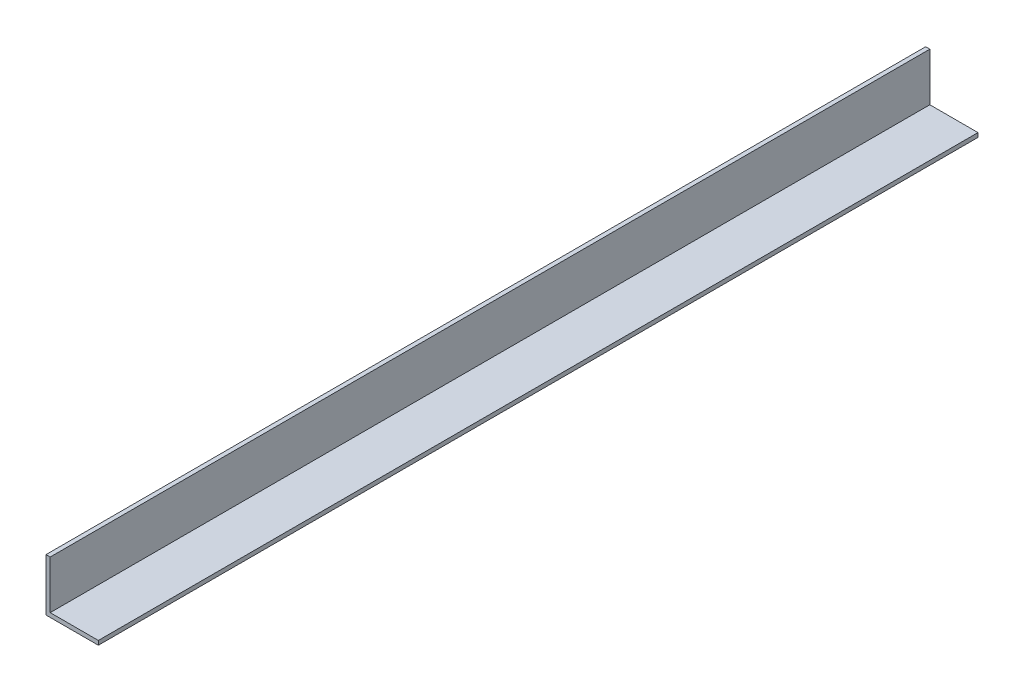
ISO-10303-21;
HEADER;
FILE_DESCRIPTION(('STEP AP214'),'2;1');
FILE_NAME('part.step','',(''),(''),'','','');
FILE_SCHEMA(('AUTOMOTIVE_DESIGN { 1 0 10303 214 1 1 1 1 }'));
ENDSEC;
DATA;
#1=APPLICATION_CONTEXT('core data for automotive mechanical design processes');
#2=APPLICATION_PROTOCOL_DEFINITION('international standard','automotive_design',2000,#1);
#3=PRODUCT_CONTEXT('',#1,'mechanical');
#4=PRODUCT('Part','Part','',(#3));
#5=PRODUCT_RELATED_PRODUCT_CATEGORY('part','',(#4));
#6=PRODUCT_DEFINITION_FORMATION('','',#4);
#7=PRODUCT_DEFINITION_CONTEXT('part definition',#1,'design');
#8=PRODUCT_DEFINITION('design','',#6,#7);
#9=PRODUCT_DEFINITION_SHAPE('','',#8);
#10=(LENGTH_UNIT() NAMED_UNIT(*) SI_UNIT(.MILLI.,.METRE.));
#11=(NAMED_UNIT(*) PLANE_ANGLE_UNIT() SI_UNIT($,.RADIAN.));
#12=(NAMED_UNIT(*) SI_UNIT($,.STERADIAN.) SOLID_ANGLE_UNIT());
#13=UNCERTAINTY_MEASURE_WITH_UNIT(LENGTH_MEASURE(1.E-05),#10,'distance_accuracy_value','');
#14=(GEOMETRIC_REPRESENTATION_CONTEXT(3) GLOBAL_UNCERTAINTY_ASSIGNED_CONTEXT((#13)) GLOBAL_UNIT_ASSIGNED_CONTEXT((#10,
#11,#12)) REPRESENTATION_CONTEXT('',''));
#15=CARTESIAN_POINT('',(0.,0.,0.));
#16=DIRECTION('',(0.,0.,1.));
#17=DIRECTION('',(1.,0.,0.));
#18=AXIS2_PLACEMENT_3D('',#15,#16,#17);
#19=CARTESIAN_POINT('',(-40.6131038732955,18.1238301559792,840.));
#20=DIRECTION('',(0.,-1.,0.));
#21=DIRECTION('',(0.,0.,-1.));
#22=AXIS2_PLACEMENT_3D('',#19,#20,#21);
#23=PLANE('',#22);
#24=DIRECTION('',(-1.,0.,0.));
#25=VECTOR('',#24,1.);
#26=CARTESIAN_POINT('',(-40.6131038732955,18.1238301559792,0.));
#27=LINE('',#26,#25);
#28=CARTESIAN_POINT('',(-36.6131038732955,18.1238301559792,0.));
#29=VERTEX_POINT('',#28);
#30=CARTESIAN_POINT('',(-40.6131038732955,18.1238301559792,0.));
#31=VERTEX_POINT('',#30);
#32=EDGE_CURVE('E117',#29,#31,#27,.T.);
#33=ORIENTED_EDGE('',*,*,#32,.T.);
#34=DIRECTION('',(0.,0.,-1.));
#35=VECTOR('',#34,1.);
#36=CARTESIAN_POINT('',(-40.6131038732955,18.1238301559792,840.));
#37=LINE('',#36,#35);
#38=CARTESIAN_POINT('',(-40.6131038732955,18.1238301559792,840.));
#39=VERTEX_POINT('',#38);
#40=EDGE_CURVE('E11',#39,#31,#37,.T.);
#41=ORIENTED_EDGE('',*,*,#40,.F.);
#42=DIRECTION('',(-1.,0.,0.));
#43=VECTOR('',#42,1.);
#44=CARTESIAN_POINT('',(-40.6131038732955,18.1238301559792,840.));
#45=LINE('',#44,#43);
#46=CARTESIAN_POINT('',(-36.6131038732955,18.1238301559792,840.));
#47=VERTEX_POINT('',#46);
#48=EDGE_CURVE('E127',#47,#39,#45,.T.);
#49=ORIENTED_EDGE('',*,*,#48,.F.);
#50=DIRECTION('',(0.,0.,-1.));
#51=VECTOR('',#50,1.);
#52=CARTESIAN_POINT('',(-36.6131038732955,18.1238301559792,840.));
#53=LINE('',#52,#51);
#54=EDGE_CURVE('E113',#47,#29,#53,.T.);
#55=ORIENTED_EDGE('',*,*,#54,.T.);
#56=EDGE_LOOP('',(#33,#41,#49,#55));
#57=FACE_BOUND('',#56,.T.);
#58=ADVANCED_FACE('F33',(#57),#23,.F.);
#59=CARTESIAN_POINT('',(-40.6131038732955,-31.8761698440208,840.));
#60=DIRECTION('',(1.,0.,0.));
#61=DIRECTION('',(0.,0.,-1.));
#62=AXIS2_PLACEMENT_3D('',#59,#60,#61);
#63=PLANE('',#62);
#64=DIRECTION('',(0.,-1.,0.));
#65=VECTOR('',#64,1.);
#66=CARTESIAN_POINT('',(-40.6131038732955,-31.8761698440208,0.));
#67=LINE('',#66,#65);
#68=CARTESIAN_POINT('',(-40.6131038732955,-31.8761698440208,0.));
#69=VERTEX_POINT('',#68);
#70=EDGE_CURVE('E120',#31,#69,#67,.T.);
#71=ORIENTED_EDGE('',*,*,#70,.T.);
#72=DIRECTION('',(0.,0.,-1.));
#73=VECTOR('',#72,1.);
#74=CARTESIAN_POINT('',(-40.6131038732955,-31.8761698440208,840.));
#75=LINE('',#74,#73);
#76=CARTESIAN_POINT('',(-40.6131038732955,-31.8761698440208,840.));
#77=VERTEX_POINT('',#76);
#78=EDGE_CURVE('E41',#77,#69,#75,.T.);
#79=ORIENTED_EDGE('',*,*,#78,.F.);
#80=DIRECTION('',(0.,-1.,0.));
#81=VECTOR('',#80,1.);
#82=CARTESIAN_POINT('',(-40.6131038732955,-31.8761698440208,840.));
#83=LINE('',#82,#81);
#84=EDGE_CURVE('E86',#39,#77,#83,.T.);
#85=ORIENTED_EDGE('',*,*,#84,.F.);
#86=ORIENTED_EDGE('',*,*,#40,.T.);
#87=EDGE_LOOP('',(#71,#79,#85,#86));
#88=FACE_BOUND('',#87,.T.);
#89=ADVANCED_FACE('F151',(#88),#63,.F.);
#90=CARTESIAN_POINT('',(9.38689612670451,-31.8761698440208,840.));
#91=DIRECTION('',(0.,1.,0.));
#92=DIRECTION('',(0.,0.,1.));
#93=AXIS2_PLACEMENT_3D('',#90,#91,#92);
#94=PLANE('',#93);
#95=DIRECTION('',(1.,0.,0.));
#96=VECTOR('',#95,1.);
#97=CARTESIAN_POINT('',(9.38689612670451,-31.8761698440208,0.));
#98=LINE('',#97,#96);
#99=CARTESIAN_POINT('',(9.38689612670451,-31.8761698440208,0.));
#100=VERTEX_POINT('',#99);
#101=EDGE_CURVE('E122',#69,#100,#98,.T.);
#102=ORIENTED_EDGE('',*,*,#101,.T.);
#103=DIRECTION('',(0.,0.,-1.));
#104=VECTOR('',#103,1.);
#105=CARTESIAN_POINT('',(9.38689612670451,-31.8761698440208,840.));
#106=LINE('',#105,#104);
#107=CARTESIAN_POINT('',(9.38689612670451,-31.8761698440208,840.));
#108=VERTEX_POINT('',#107);
#109=EDGE_CURVE('E108',#108,#100,#106,.T.);
#110=ORIENTED_EDGE('',*,*,#109,.F.);
#111=DIRECTION('',(1.,0.,0.));
#112=VECTOR('',#111,1.);
#113=CARTESIAN_POINT('',(9.38689612670451,-31.8761698440208,840.));
#114=LINE('',#113,#112);
#115=EDGE_CURVE('E99',#77,#108,#114,.T.);
#116=ORIENTED_EDGE('',*,*,#115,.F.);
#117=ORIENTED_EDGE('',*,*,#78,.T.);
#118=EDGE_LOOP('',(#102,#110,#116,#117));
#119=FACE_BOUND('',#118,.T.);
#120=ADVANCED_FACE('F133',(#119),#94,.F.);
#121=CARTESIAN_POINT('',(9.38689612670451,-27.8761698440208,840.));
#122=DIRECTION('',(-1.,0.,0.));
#123=DIRECTION('',(0.,0.,1.));
#124=AXIS2_PLACEMENT_3D('',#121,#122,#123);
#125=PLANE('',#124);
#126=DIRECTION('',(0.,1.,0.));
#127=VECTOR('',#126,1.);
#128=CARTESIAN_POINT('',(9.38689612670451,-27.8761698440208,0.));
#129=LINE('',#128,#127);
#130=CARTESIAN_POINT('',(9.38689612670451,-27.8761698440208,0.));
#131=VERTEX_POINT('',#130);
#132=EDGE_CURVE('E107',#100,#131,#129,.T.);
#133=ORIENTED_EDGE('',*,*,#132,.T.);
#134=DIRECTION('',(0.,0.,-1.));
#135=VECTOR('',#134,1.);
#136=CARTESIAN_POINT('',(9.38689612670451,-27.8761698440208,840.));
#137=LINE('',#136,#135);
#138=CARTESIAN_POINT('',(9.38689612670451,-27.8761698440208,840.));
#139=VERTEX_POINT('',#138);
#140=EDGE_CURVE('E104',#139,#131,#137,.T.);
#141=ORIENTED_EDGE('',*,*,#140,.F.);
#142=DIRECTION('',(0.,1.,0.));
#143=VECTOR('',#142,1.);
#144=CARTESIAN_POINT('',(9.38689612670451,-27.8761698440208,840.));
#145=LINE('',#144,#143);
#146=EDGE_CURVE('E93',#108,#139,#145,.T.);
#147=ORIENTED_EDGE('',*,*,#146,.F.);
#148=ORIENTED_EDGE('',*,*,#109,.T.);
#149=EDGE_LOOP('',(#133,#141,#147,#148));
#150=FACE_BOUND('',#149,.T.);
#151=ADVANCED_FACE('F105',(#150),#125,.F.);
#152=CARTESIAN_POINT('',(-36.6131038732955,-27.8761698440208,840.));
#153=DIRECTION('',(0.,-1.,0.));
#154=DIRECTION('',(0.,0.,-1.));
#155=AXIS2_PLACEMENT_3D('',#152,#153,#154);
#156=PLANE('',#155);
#157=DIRECTION('',(-1.,0.,0.));
#158=VECTOR('',#157,1.);
#159=CARTESIAN_POINT('',(-36.6131038732955,-27.8761698440208,0.));
#160=LINE('',#159,#158);
#161=CARTESIAN_POINT('',(-36.6131038732955,-27.8761698440208,0.));
#162=VERTEX_POINT('',#161);
#163=EDGE_CURVE('E72',#131,#162,#160,.T.);
#164=ORIENTED_EDGE('',*,*,#163,.T.);
#165=DIRECTION('',(0.,0.,-1.));
#166=VECTOR('',#165,1.);
#167=CARTESIAN_POINT('',(-36.6131038732955,-27.8761698440208,840.));
#168=LINE('',#167,#166);
#169=CARTESIAN_POINT('',(-36.6131038732955,-27.8761698440208,840.));
#170=VERTEX_POINT('',#169);
#171=EDGE_CURVE('E109',#170,#162,#168,.T.);
#172=ORIENTED_EDGE('',*,*,#171,.F.);
#173=DIRECTION('',(-1.,0.,0.));
#174=VECTOR('',#173,1.);
#175=CARTESIAN_POINT('',(-36.6131038732955,-27.8761698440208,840.));
#176=LINE('',#175,#174);
#177=EDGE_CURVE('E97',#139,#170,#176,.T.);
#178=ORIENTED_EDGE('',*,*,#177,.F.);
#179=ORIENTED_EDGE('',*,*,#140,.T.);
#180=EDGE_LOOP('',(#164,#172,#178,#179));
#181=FACE_BOUND('',#180,.T.);
#182=ADVANCED_FACE('F111',(#181),#156,.F.);
#183=CARTESIAN_POINT('',(-36.6131038732955,18.1238301559792,840.));
#184=DIRECTION('',(-1.,0.,0.));
#185=DIRECTION('',(0.,0.,1.));
#186=AXIS2_PLACEMENT_3D('',#183,#184,#185);
#187=PLANE('',#186);
#188=DIRECTION('',(0.,1.,0.));
#189=VECTOR('',#188,1.);
#190=CARTESIAN_POINT('',(-36.6131038732955,18.1238301559792,0.));
#191=LINE('',#190,#189);
#192=EDGE_CURVE('E78',#162,#29,#191,.T.);
#193=ORIENTED_EDGE('',*,*,#192,.T.);
#194=ORIENTED_EDGE('',*,*,#54,.F.);
#195=DIRECTION('',(0.,1.,0.));
#196=VECTOR('',#195,1.);
#197=CARTESIAN_POINT('',(-36.6131038732955,18.1238301559792,840.));
#198=LINE('',#197,#196);
#199=EDGE_CURVE('E49',#170,#47,#198,.T.);
#200=ORIENTED_EDGE('',*,*,#199,.F.);
#201=ORIENTED_EDGE('',*,*,#171,.T.);
#202=EDGE_LOOP('',(#193,#194,#200,#201));
#203=FACE_BOUND('',#202,.T.);
#204=ADVANCED_FACE('F140',(#203),#187,.F.);
#205=CARTESIAN_POINT('',(0.,0.,840.));
#206=DIRECTION('',(0.,0.,-1.));
#207=DIRECTION('',(-1.,0.,0.));
#208=AXIS2_PLACEMENT_3D('',#205,#206,#207);
#209=PLANE('',#208);
#210=ORIENTED_EDGE('',*,*,#48,.T.);
#211=ORIENTED_EDGE('',*,*,#84,.T.);
#212=ORIENTED_EDGE('',*,*,#115,.T.);
#213=ORIENTED_EDGE('',*,*,#146,.T.);
#214=ORIENTED_EDGE('',*,*,#177,.T.);
#215=ORIENTED_EDGE('',*,*,#199,.T.);
#216=EDGE_LOOP('',(#210,#211,#212,#213,#214,#215));
#217=FACE_BOUND('',#216,.T.);
#218=ADVANCED_FACE('F95',(#217),#209,.F.);
#219=CARTESIAN_POINT('',(0.,0.,0.));
#220=DIRECTION('',(0.,0.,-1.));
#221=DIRECTION('',(-1.,0.,0.));
#222=AXIS2_PLACEMENT_3D('',#219,#220,#221);
#223=PLANE('',#222);
#224=ORIENTED_EDGE('',*,*,#32,.F.);
#225=ORIENTED_EDGE('',*,*,#192,.F.);
#226=ORIENTED_EDGE('',*,*,#163,.F.);
#227=ORIENTED_EDGE('',*,*,#132,.F.);
#228=ORIENTED_EDGE('',*,*,#101,.F.);
#229=ORIENTED_EDGE('',*,*,#70,.F.);
#230=EDGE_LOOP('',(#224,#225,#226,#227,#228,#229));
#231=FACE_BOUND('',#230,.T.);
#232=ADVANCED_FACE('F136',(#231),#223,.T.);
#233=CLOSED_SHELL('',(#58,#89,#120,#151,#182,#204,#218,#232));
#234=MANIFOLD_SOLID_BREP('B2',#233);
#235=ADVANCED_BREP_SHAPE_REPRESENTATION('',(#18,#234),#14);
#236=SHAPE_DEFINITION_REPRESENTATION(#9,#235);
ENDSEC;
END-ISO-10303-21;
